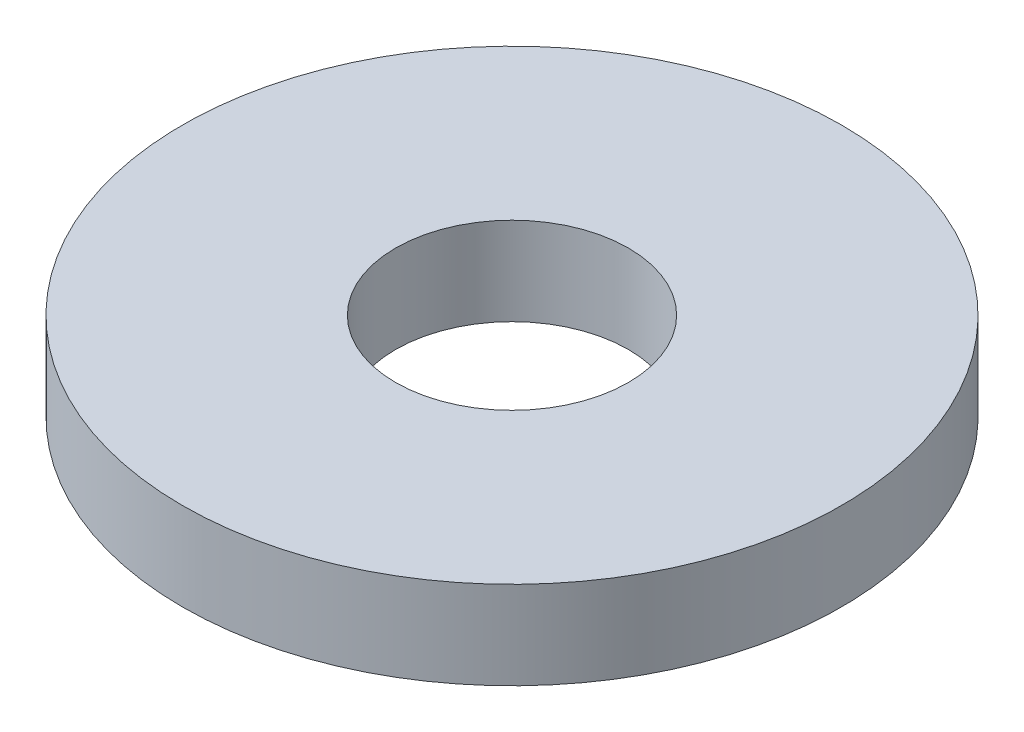
ISO-10303-21;
HEADER;
FILE_DESCRIPTION(('STEP AP214'),'2;1');
FILE_NAME('part.step','',(''),(''),'','','');
FILE_SCHEMA(('AUTOMOTIVE_DESIGN { 1 0 10303 214 1 1 1 1 }'));
ENDSEC;
DATA;
#1=APPLICATION_CONTEXT('core data for automotive mechanical design processes');
#2=APPLICATION_PROTOCOL_DEFINITION('international standard','automotive_design',2000,#1);
#3=PRODUCT_CONTEXT('',#1,'mechanical');
#4=PRODUCT('Part','Part','',(#3));
#5=PRODUCT_RELATED_PRODUCT_CATEGORY('part','',(#4));
#6=PRODUCT_DEFINITION_FORMATION('','',#4);
#7=PRODUCT_DEFINITION_CONTEXT('part definition',#1,'design');
#8=PRODUCT_DEFINITION('design','',#6,#7);
#9=PRODUCT_DEFINITION_SHAPE('','',#8);
#10=(LENGTH_UNIT() NAMED_UNIT(*) SI_UNIT(.MILLI.,.METRE.));
#11=(NAMED_UNIT(*) PLANE_ANGLE_UNIT() SI_UNIT($,.RADIAN.));
#12=(NAMED_UNIT(*) SI_UNIT($,.STERADIAN.) SOLID_ANGLE_UNIT());
#13=UNCERTAINTY_MEASURE_WITH_UNIT(LENGTH_MEASURE(1.E-05),#10,'distance_accuracy_value','');
#14=(GEOMETRIC_REPRESENTATION_CONTEXT(3) GLOBAL_UNCERTAINTY_ASSIGNED_CONTEXT((#13)) GLOBAL_UNIT_ASSIGNED_CONTEXT((#10,
#11,#12)) REPRESENTATION_CONTEXT('',''));
#15=CARTESIAN_POINT('',(0.,0.,0.));
#16=DIRECTION('',(0.,0.,1.));
#17=DIRECTION('',(1.,0.,0.));
#18=AXIS2_PLACEMENT_3D('',#15,#16,#17);
#19=CARTESIAN_POINT('',(0.,2.,0.));
#20=DIRECTION('',(0.,1.,0.));
#21=DIRECTION('',(0.,0.,1.));
#22=AXIS2_PLACEMENT_3D('',#19,#20,#21);
#23=PLANE('',#22);
#24=CARTESIAN_POINT('',(0.,2.,0.));
#25=DIRECTION('',(0.,1.,0.));
#26=DIRECTION('',(0.,0.,1.));
#27=AXIS2_PLACEMENT_3D('',#24,#25,#26);
#28=CIRCLE('',#27,7.5);
#29=CARTESIAN_POINT('',(0.,2.,7.5));
#30=VERTEX_POINT('',#29);
#31=EDGE_CURVE('E10',#30,#30,#28,.T.);
#32=ORIENTED_EDGE('',*,*,#31,.T.);
#33=EDGE_LOOP('',(#32));
#34=FACE_BOUND('',#33,.T.);
#35=CARTESIAN_POINT('',(0.,2.,0.));
#36=DIRECTION('',(0.,1.,0.));
#37=DIRECTION('',(0.,0.,1.));
#38=AXIS2_PLACEMENT_3D('',#35,#36,#37);
#39=CIRCLE('',#38,2.65);
#40=CARTESIAN_POINT('',(0.,2.,2.65));
#41=VERTEX_POINT('',#40);
#42=EDGE_CURVE('E42',#41,#41,#39,.T.);
#43=ORIENTED_EDGE('',*,*,#42,.F.);
#44=EDGE_LOOP('',(#43));
#45=FACE_BOUND('',#44,.T.);
#46=ADVANCED_FACE('F31',(#34,#45),#23,.T.);
#47=CARTESIAN_POINT('',(0.,0.,0.));
#48=DIRECTION('',(0.,1.,0.));
#49=DIRECTION('',(0.,0.,1.));
#50=AXIS2_PLACEMENT_3D('',#47,#48,#49);
#51=PLANE('',#50);
#52=CARTESIAN_POINT('',(0.,0.,0.));
#53=DIRECTION('',(0.,1.,0.));
#54=DIRECTION('',(0.,0.,1.));
#55=AXIS2_PLACEMENT_3D('',#52,#53,#54);
#56=CIRCLE('',#55,7.5);
#57=CARTESIAN_POINT('',(0.,0.,7.5));
#58=VERTEX_POINT('',#57);
#59=EDGE_CURVE('E35',#58,#58,#56,.T.);
#60=ORIENTED_EDGE('',*,*,#59,.F.);
#61=EDGE_LOOP('',(#60));
#62=FACE_BOUND('',#61,.T.);
#63=CARTESIAN_POINT('',(0.,0.,0.));
#64=DIRECTION('',(0.,1.,0.));
#65=DIRECTION('',(0.,0.,1.));
#66=AXIS2_PLACEMENT_3D('',#63,#64,#65);
#67=CIRCLE('',#66,2.65);
#68=CARTESIAN_POINT('',(0.,0.,2.65));
#69=VERTEX_POINT('',#68);
#70=EDGE_CURVE('E44',#69,#69,#67,.T.);
#71=ORIENTED_EDGE('',*,*,#70,.T.);
#72=EDGE_LOOP('',(#71));
#73=FACE_BOUND('',#72,.T.);
#74=ADVANCED_FACE('F54',(#62,#73),#51,.F.);
#75=CARTESIAN_POINT('',(0.,2.,0.));
#76=DIRECTION('',(0.,-1.,0.));
#77=DIRECTION('',(0.,0.,-1.));
#78=AXIS2_PLACEMENT_3D('',#75,#76,#77);
#79=CYLINDRICAL_SURFACE('',#78,7.5);
#80=ORIENTED_EDGE('',*,*,#31,.F.);
#81=EDGE_LOOP('',(#80));
#82=FACE_BOUND('',#81,.T.);
#83=ORIENTED_EDGE('',*,*,#59,.T.);
#84=EDGE_LOOP('',(#83));
#85=FACE_BOUND('',#84,.T.);
#86=ADVANCED_FACE('F33',(#82,#85),#79,.T.);
#87=CARTESIAN_POINT('',(0.,2.,0.));
#88=DIRECTION('',(0.,-1.,0.));
#89=DIRECTION('',(0.,0.,-1.));
#90=AXIS2_PLACEMENT_3D('',#87,#88,#89);
#91=CYLINDRICAL_SURFACE('',#90,2.65);
#92=ORIENTED_EDGE('',*,*,#42,.T.);
#93=EDGE_LOOP('',(#92));
#94=FACE_BOUND('',#93,.T.);
#95=ORIENTED_EDGE('',*,*,#70,.F.);
#96=EDGE_LOOP('',(#95));
#97=FACE_BOUND('',#96,.T.);
#98=ADVANCED_FACE('F50',(#94,#97),#91,.F.);
#99=CLOSED_SHELL('',(#46,#74,#86,#98));
#100=MANIFOLD_SOLID_BREP('B2',#99);
#101=ADVANCED_BREP_SHAPE_REPRESENTATION('',(#18,#100),#14);
#102=SHAPE_DEFINITION_REPRESENTATION(#9,#101);
ENDSEC;
END-ISO-10303-21;
